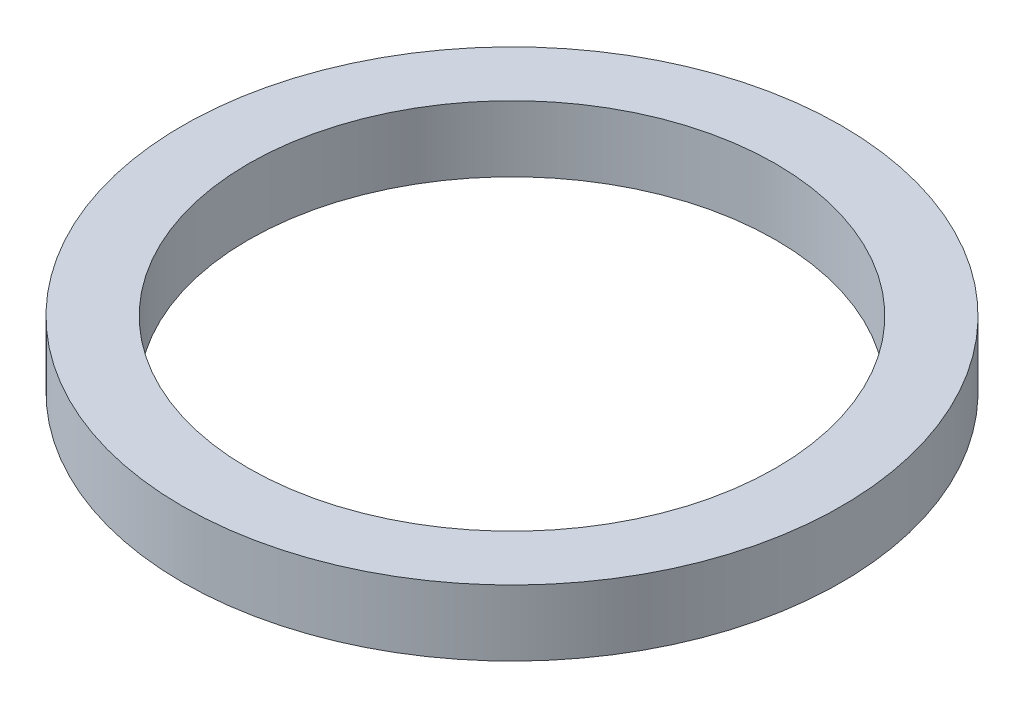
ISO-10303-21;
HEADER;
FILE_DESCRIPTION(('STEP AP214'),'2;1');
FILE_NAME('part.step','',(''),(''),'','','');
FILE_SCHEMA(('AUTOMOTIVE_DESIGN { 1 0 10303 214 1 1 1 1 }'));
ENDSEC;
DATA;
#1=APPLICATION_CONTEXT('core data for automotive mechanical design processes');
#2=APPLICATION_PROTOCOL_DEFINITION('international standard','automotive_design',2000,#1);
#3=PRODUCT_CONTEXT('',#1,'mechanical');
#4=PRODUCT('Part','Part','',(#3));
#5=PRODUCT_RELATED_PRODUCT_CATEGORY('part','',(#4));
#6=PRODUCT_DEFINITION_FORMATION('','',#4);
#7=PRODUCT_DEFINITION_CONTEXT('part definition',#1,'design');
#8=PRODUCT_DEFINITION('design','',#6,#7);
#9=PRODUCT_DEFINITION_SHAPE('','',#8);
#10=(LENGTH_UNIT() NAMED_UNIT(*) SI_UNIT(.MILLI.,.METRE.));
#11=(NAMED_UNIT(*) PLANE_ANGLE_UNIT() SI_UNIT($,.RADIAN.));
#12=(NAMED_UNIT(*) SI_UNIT($,.STERADIAN.) SOLID_ANGLE_UNIT());
#13=UNCERTAINTY_MEASURE_WITH_UNIT(LENGTH_MEASURE(1.E-05),#10,'distance_accuracy_value','');
#14=(GEOMETRIC_REPRESENTATION_CONTEXT(3) GLOBAL_UNCERTAINTY_ASSIGNED_CONTEXT((#13)) GLOBAL_UNIT_ASSIGNED_CONTEXT((#10,
#11,#12)) REPRESENTATION_CONTEXT('',''));
#15=CARTESIAN_POINT('',(0.,0.,0.));
#16=DIRECTION('',(0.,0.,1.));
#17=DIRECTION('',(1.,0.,0.));
#18=AXIS2_PLACEMENT_3D('',#15,#16,#17);
#19=CARTESIAN_POINT('',(0.,5.,0.));
#20=DIRECTION('',(0.,1.,0.));
#21=DIRECTION('',(0.,0.,1.));
#22=AXIS2_PLACEMENT_3D('',#19,#20,#21);
#23=PLANE('',#22);
#24=CARTESIAN_POINT('',(0.,5.,0.));
#25=DIRECTION('',(0.,1.,0.));
#26=DIRECTION('',(0.,0.,1.));
#27=AXIS2_PLACEMENT_3D('',#24,#25,#26);
#28=CIRCLE('',#27,25.);
#29=CARTESIAN_POINT('',(0.,5.,25.));
#30=VERTEX_POINT('',#29);
#31=EDGE_CURVE('E10',#30,#30,#28,.T.);
#32=ORIENTED_EDGE('',*,*,#31,.T.);
#33=EDGE_LOOP('',(#32));
#34=FACE_BOUND('',#33,.T.);
#35=CARTESIAN_POINT('',(0.,5.,0.));
#36=DIRECTION('',(0.,1.,0.));
#37=DIRECTION('',(0.,0.,1.));
#38=AXIS2_PLACEMENT_3D('',#35,#36,#37);
#39=CIRCLE('',#38,20.);
#40=CARTESIAN_POINT('',(0.,5.,20.));
#41=VERTEX_POINT('',#40);
#42=EDGE_CURVE('E53',#41,#41,#39,.T.);
#43=ORIENTED_EDGE('',*,*,#42,.F.);
#44=EDGE_LOOP('',(#43));
#45=FACE_BOUND('',#44,.T.);
#46=ADVANCED_FACE('F40',(#34,#45),#23,.T.);
#47=CARTESIAN_POINT('',(0.,0.,0.));
#48=DIRECTION('',(0.,1.,0.));
#49=DIRECTION('',(0.,0.,1.));
#50=AXIS2_PLACEMENT_3D('',#47,#48,#49);
#51=PLANE('',#50);
#52=CARTESIAN_POINT('',(0.,0.,0.));
#53=DIRECTION('',(0.,1.,0.));
#54=DIRECTION('',(0.,0.,1.));
#55=AXIS2_PLACEMENT_3D('',#52,#53,#54);
#56=CIRCLE('',#55,25.);
#57=CARTESIAN_POINT('',(0.,0.,25.));
#58=VERTEX_POINT('',#57);
#59=EDGE_CURVE('E44',#58,#58,#56,.T.);
#60=ORIENTED_EDGE('',*,*,#59,.F.);
#61=EDGE_LOOP('',(#60));
#62=FACE_BOUND('',#61,.T.);
#63=CARTESIAN_POINT('',(0.,0.,0.));
#64=DIRECTION('',(0.,1.,0.));
#65=DIRECTION('',(0.,0.,1.));
#66=AXIS2_PLACEMENT_3D('',#63,#64,#65);
#67=CIRCLE('',#66,20.);
#68=CARTESIAN_POINT('',(0.,0.,20.));
#69=VERTEX_POINT('',#68);
#70=EDGE_CURVE('E55',#69,#69,#67,.T.);
#71=ORIENTED_EDGE('',*,*,#70,.T.);
#72=EDGE_LOOP('',(#71));
#73=FACE_BOUND('',#72,.T.);
#74=ADVANCED_FACE('F67',(#62,#73),#51,.F.);
#75=CARTESIAN_POINT('',(0.,5.,0.));
#76=DIRECTION('',(0.,-1.,0.));
#77=DIRECTION('',(0.,0.,-1.));
#78=AXIS2_PLACEMENT_3D('',#75,#76,#77);
#79=CYLINDRICAL_SURFACE('',#78,25.);
#80=ORIENTED_EDGE('',*,*,#31,.F.);
#81=EDGE_LOOP('',(#80));
#82=FACE_BOUND('',#81,.T.);
#83=ORIENTED_EDGE('',*,*,#59,.T.);
#84=EDGE_LOOP('',(#83));
#85=FACE_BOUND('',#84,.T.);
#86=ADVANCED_FACE('F42',(#82,#85),#79,.T.);
#87=CARTESIAN_POINT('',(0.,5.,0.));
#88=DIRECTION('',(0.,-1.,0.));
#89=DIRECTION('',(0.,0.,-1.));
#90=AXIS2_PLACEMENT_3D('',#87,#88,#89);
#91=CYLINDRICAL_SURFACE('',#90,20.);
#92=ORIENTED_EDGE('',*,*,#42,.T.);
#93=EDGE_LOOP('',(#92));
#94=FACE_BOUND('',#93,.T.);
#95=ORIENTED_EDGE('',*,*,#70,.F.);
#96=EDGE_LOOP('',(#95));
#97=FACE_BOUND('',#96,.T.);
#98=ADVANCED_FACE('F63',(#94,#97),#91,.F.);
#99=CLOSED_SHELL('',(#46,#74,#86,#98));
#100=MANIFOLD_SOLID_BREP('B2',#99);
#101=ADVANCED_BREP_SHAPE_REPRESENTATION('',(#18,#100),#14);
#102=SHAPE_DEFINITION_REPRESENTATION(#9,#101);
ENDSEC;
END-ISO-10303-21;
